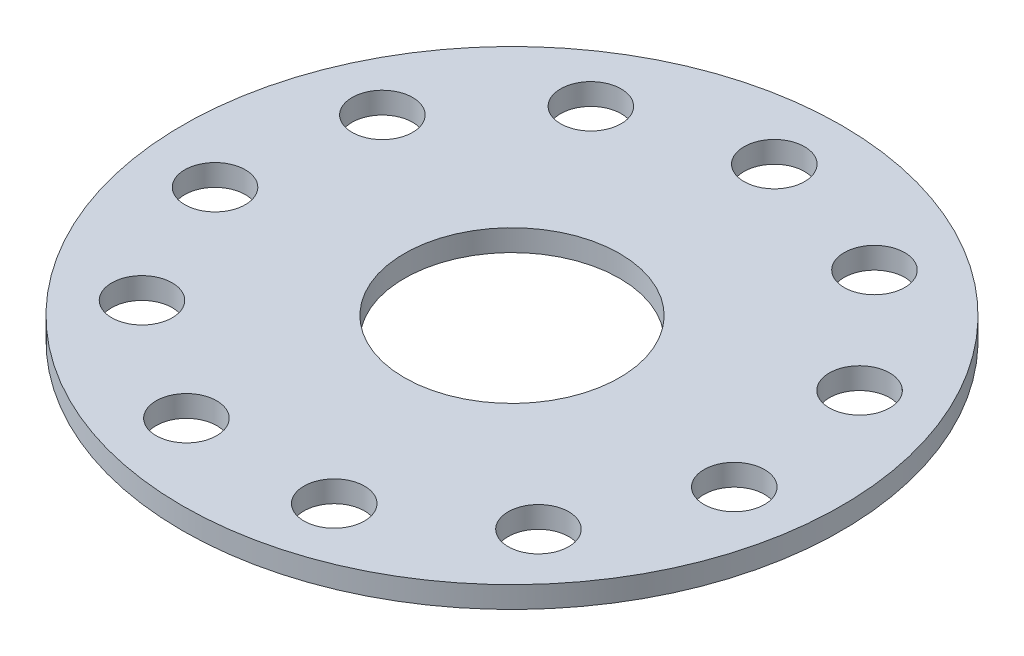
ISO-10303-21;
HEADER;
FILE_DESCRIPTION(('STEP AP214'),'2;1');
FILE_NAME('part.step','',(''),(''),'','','');
FILE_SCHEMA(('AUTOMOTIVE_DESIGN { 1 0 10303 214 1 1 1 1 }'));
ENDSEC;
DATA;
#1=APPLICATION_CONTEXT('core data for automotive mechanical design processes');
#2=APPLICATION_PROTOCOL_DEFINITION('international standard','automotive_design',2000,#1);
#3=PRODUCT_CONTEXT('',#1,'mechanical');
#4=PRODUCT('Part','Part','',(#3));
#5=PRODUCT_RELATED_PRODUCT_CATEGORY('part','',(#4));
#6=PRODUCT_DEFINITION_FORMATION('','',#4);
#7=PRODUCT_DEFINITION_CONTEXT('part definition',#1,'design');
#8=PRODUCT_DEFINITION('design','',#6,#7);
#9=PRODUCT_DEFINITION_SHAPE('','',#8);
#10=(LENGTH_UNIT() NAMED_UNIT(*) SI_UNIT(.MILLI.,.METRE.));
#11=(NAMED_UNIT(*) PLANE_ANGLE_UNIT() SI_UNIT($,.RADIAN.));
#12=(NAMED_UNIT(*) SI_UNIT($,.STERADIAN.) SOLID_ANGLE_UNIT());
#13=UNCERTAINTY_MEASURE_WITH_UNIT(LENGTH_MEASURE(1.E-05),#10,'distance_accuracy_value','');
#14=(GEOMETRIC_REPRESENTATION_CONTEXT(3) GLOBAL_UNCERTAINTY_ASSIGNED_CONTEXT((#13)) GLOBAL_UNIT_ASSIGNED_CONTEXT((#10,
#11,#12)) REPRESENTATION_CONTEXT('',''));
#15=CARTESIAN_POINT('',(0.,0.,0.));
#16=DIRECTION('',(0.,0.,1.));
#17=DIRECTION('',(1.,0.,0.));
#18=AXIS2_PLACEMENT_3D('',#15,#16,#17);
#19=CARTESIAN_POINT('',(0.,1.6002,0.));
#20=DIRECTION('',(0.,1.,0.));
#21=DIRECTION('',(0.,0.,1.));
#22=AXIS2_PLACEMENT_3D('',#19,#20,#21);
#23=PLANE('',#22);
#24=CARTESIAN_POINT('',(10.5424959403839,1.6002,-16.4044438902082));
#25=DIRECTION('',(0.,1.,0.));
#26=DIRECTION('',(-0.540640817455586,0.,0.841253532831189));
#27=AXIS2_PLACEMENT_3D('',#24,#25,#26);
#28=CIRCLE('',#27,2.25);
#29=CARTESIAN_POINT('',(9.32605410110887,1.6002,-14.511623441338));
#30=VERTEX_POINT('',#29);
#31=EDGE_CURVE('E63',#30,#30,#28,.T.);
#32=ORIENTED_EDGE('',*,*,#31,.F.);
#33=EDGE_LOOP('',(#32));
#34=FACE_BOUND('',#33,.T.);
#35=CARTESIAN_POINT('',(17.737823909413,1.6002,-8.100592753537));
#36=DIRECTION('',(0.,1.,0.));
#37=DIRECTION('',(-0.909631995354513,0.,0.415415013001897));
#38=AXIS2_PLACEMENT_3D('',#35,#36,#37);
#39=CIRCLE('',#38,2.25);
#40=CARTESIAN_POINT('',(15.6911519198654,1.6002,-7.16590897428273));
#41=VERTEX_POINT('',#40);
#42=EDGE_CURVE('E69',#41,#41,#39,.T.);
#43=ORIENTED_EDGE('',*,*,#42,.F.);
#44=EDGE_LOOP('',(#43));
#45=FACE_BOUND('',#44,.T.);
#46=CARTESIAN_POINT('',(19.3015181166782,1.6002,2.77513934632886));
#47=DIRECTION('',(0.,1.,0.));
#48=DIRECTION('',(-0.989821441880934,0.,-0.142314838273275));
#49=AXIS2_PLACEMENT_3D('',#46,#47,#48);
#50=CIRCLE('',#49,2.25);
#51=CARTESIAN_POINT('',(17.0744198724461,1.6002,2.45493096021399));
#52=VERTEX_POINT('',#51);
#53=EDGE_CURVE('E75',#52,#52,#50,.T.);
#54=ORIENTED_EDGE('',*,*,#53,.F.);
#55=EDGE_LOOP('',(#54));
#56=FACE_BOUND('',#55,.T.);
#57=CARTESIAN_POINT('',(14.7371166999082,1.6002,12.7697843119329));
#58=DIRECTION('',(0.,1.,0.));
#59=DIRECTION('',(-0.755749574354264,0.,-0.654860733945278));
#60=AXIS2_PLACEMENT_3D('',#57,#58,#59);
#61=CIRCLE('',#60,2.25);
#62=CARTESIAN_POINT('',(13.0366801576111,1.6002,11.2963476605561));
#63=VERTEX_POINT('',#62);
#64=EDGE_CURVE('E81',#63,#63,#61,.T.);
#65=ORIENTED_EDGE('',*,*,#64,.F.);
#66=EDGE_LOOP('',(#65));
#67=FACE_BOUND('',#66,.T.);
#68=CARTESIAN_POINT('',(5.49378485840803,1.6002,18.7101129854827));
#69=DIRECTION('',(0.,1.,0.));
#70=DIRECTION('',(-0.281732556841437,0.,-0.959492973614495));
#71=AXIS2_PLACEMENT_3D('',#68,#69,#70);
#72=CIRCLE('',#71,2.25);
#73=CARTESIAN_POINT('',(4.85988660551479,1.6002,16.55125379485));
#74=VERTEX_POINT('',#73);
#75=EDGE_CURVE('E87',#74,#74,#72,.T.);
#76=ORIENTED_EDGE('',*,*,#75,.F.);
#77=EDGE_LOOP('',(#76));
#78=FACE_BOUND('',#77,.T.);
#79=CARTESIAN_POINT('',(-5.49378485840776,1.6002,18.7101129854827));
#80=DIRECTION('',(0.,1.,0.));
#81=DIRECTION('',(0.281732556841423,0.,-0.959492973614499));
#82=AXIS2_PLACEMENT_3D('',#79,#80,#81);
#83=CIRCLE('',#82,2.25);
#84=CARTESIAN_POINT('',(-4.85988660551455,1.6002,16.5512537948501));
#85=VERTEX_POINT('',#84);
#86=EDGE_CURVE('E93',#85,#85,#83,.T.);
#87=ORIENTED_EDGE('',*,*,#86,.F.);
#88=EDGE_LOOP('',(#87));
#89=FACE_BOUND('',#88,.T.);
#90=CARTESIAN_POINT('',(-14.737116699908,1.6002,12.7697843119331));
#91=DIRECTION('',(0.,1.,0.));
#92=DIRECTION('',(0.755749574354255,0.,-0.654860733945289));
#93=AXIS2_PLACEMENT_3D('',#90,#91,#92);
#94=CIRCLE('',#93,2.25);
#95=CARTESIAN_POINT('',(-13.0366801576109,1.6002,11.2963476605562));
#96=VERTEX_POINT('',#95);
#97=EDGE_CURVE('E99',#96,#96,#94,.T.);
#98=ORIENTED_EDGE('',*,*,#97,.F.);
#99=EDGE_LOOP('',(#98));
#100=FACE_BOUND('',#99,.T.);
#101=CARTESIAN_POINT('',(-19.3015181166782,1.6002,2.77513934632913));
#102=DIRECTION('',(0.,1.,0.));
#103=DIRECTION('',(0.989821441880932,0.,-0.142314838273289));
#104=AXIS2_PLACEMENT_3D('',#101,#102,#103);
#105=CIRCLE('',#104,2.25);
#106=CARTESIAN_POINT('',(-17.0744198724461,1.6002,2.45493096021423));
#107=VERTEX_POINT('',#106);
#108=EDGE_CURVE('E105',#107,#107,#105,.T.);
#109=ORIENTED_EDGE('',*,*,#108,.F.);
#110=EDGE_LOOP('',(#109));
#111=FACE_BOUND('',#110,.T.);
#112=CARTESIAN_POINT('',(-17.7378239094131,1.6002,-8.10059275353674));
#113=DIRECTION('',(0.,1.,0.));
#114=DIRECTION('',(0.909631995354519,0.,0.415415013001884));
#115=AXIS2_PLACEMENT_3D('',#112,#113,#114);
#116=CIRCLE('',#115,2.25);
#117=CARTESIAN_POINT('',(-15.6911519198655,1.6002,-7.1659089742825));
#118=VERTEX_POINT('',#117);
#119=EDGE_CURVE('E111',#118,#118,#116,.T.);
#120=ORIENTED_EDGE('',*,*,#119,.F.);
#121=EDGE_LOOP('',(#120));
#122=FACE_BOUND('',#121,.T.);
#123=CARTESIAN_POINT('',(-10.5424959403842,1.6002,-16.404443890208));
#124=DIRECTION('',(0.,1.,0.));
#125=DIRECTION('',(0.540640817455599,0.,0.841253532831181));
#126=AXIS2_PLACEMENT_3D('',#123,#124,#125);
#127=CIRCLE('',#126,2.25);
#128=CARTESIAN_POINT('',(-9.32605410110908,1.6002,-14.5116234413379));
#129=VERTEX_POINT('',#128);
#130=EDGE_CURVE('E57',#129,#129,#127,.T.);
#131=ORIENTED_EDGE('',*,*,#130,.F.);
#132=EDGE_LOOP('',(#131));
#133=FACE_BOUND('',#132,.T.);
#134=CARTESIAN_POINT('',(0.,1.6002,-19.5));
#135=DIRECTION('',(0.,1.,0.));
#136=DIRECTION('',(0.,0.,1.));
#137=AXIS2_PLACEMENT_3D('',#134,#135,#136);
#138=CIRCLE('',#137,2.25);
#139=CARTESIAN_POINT('',(0.,1.6002,-17.25));
#140=VERTEX_POINT('',#139);
#141=EDGE_CURVE('E51',#140,#140,#138,.T.);
#142=ORIENTED_EDGE('',*,*,#141,.F.);
#143=EDGE_LOOP('',(#142));
#144=FACE_BOUND('',#143,.T.);
#145=CARTESIAN_POINT('',(0.,1.6002,0.));
#146=DIRECTION('',(0.,1.,0.));
#147=DIRECTION('',(0.,0.,1.));
#148=AXIS2_PLACEMENT_3D('',#145,#146,#147);
#149=CIRCLE('',#148,24.5);
#150=CARTESIAN_POINT('',(0.,1.6002,24.5));
#151=VERTEX_POINT('',#150);
#152=EDGE_CURVE('E10',#151,#151,#149,.T.);
#153=ORIENTED_EDGE('',*,*,#152,.T.);
#154=EDGE_LOOP('',(#153));
#155=FACE_BOUND('',#154,.T.);
#156=CARTESIAN_POINT('',(0.,1.6002,0.));
#157=DIRECTION('',(0.,1.,0.));
#158=DIRECTION('',(0.,0.,1.));
#159=AXIS2_PLACEMENT_3D('',#156,#157,#158);
#160=CIRCLE('',#159,8.);
#161=CARTESIAN_POINT('',(0.,1.6002,8.));
#162=VERTEX_POINT('',#161);
#163=EDGE_CURVE('E43',#162,#162,#160,.T.);
#164=ORIENTED_EDGE('',*,*,#163,.F.);
#165=EDGE_LOOP('',(#164));
#166=FACE_BOUND('',#165,.T.);
#167=ADVANCED_FACE('F32',(#34,#45,#56,#67,#78,#89,#100,#111,#122,#133,#144,#155,#166),#23,.T.);
#168=CARTESIAN_POINT('',(0.,0.,0.));
#169=DIRECTION('',(0.,1.,0.));
#170=DIRECTION('',(0.,0.,1.));
#171=AXIS2_PLACEMENT_3D('',#168,#169,#170);
#172=PLANE('',#171);
#173=CARTESIAN_POINT('',(10.5424959403839,0.,-16.4044438902082));
#174=DIRECTION('',(0.,1.,0.));
#175=DIRECTION('',(-0.540640817455586,0.,0.841253532831189));
#176=AXIS2_PLACEMENT_3D('',#173,#174,#175);
#177=CIRCLE('',#176,2.25);
#178=CARTESIAN_POINT('',(9.32605410110887,0.,-14.511623441338));
#179=VERTEX_POINT('',#178);
#180=EDGE_CURVE('E66',#179,#179,#177,.T.);
#181=ORIENTED_EDGE('',*,*,#180,.T.);
#182=EDGE_LOOP('',(#181));
#183=FACE_BOUND('',#182,.T.);
#184=CARTESIAN_POINT('',(17.737823909413,0.,-8.100592753537));
#185=DIRECTION('',(0.,1.,0.));
#186=DIRECTION('',(-0.909631995354513,0.,0.415415013001897));
#187=AXIS2_PLACEMENT_3D('',#184,#185,#186);
#188=CIRCLE('',#187,2.25);
#189=CARTESIAN_POINT('',(15.6911519198654,0.,-7.16590897428273));
#190=VERTEX_POINT('',#189);
#191=EDGE_CURVE('E72',#190,#190,#188,.T.);
#192=ORIENTED_EDGE('',*,*,#191,.T.);
#193=EDGE_LOOP('',(#192));
#194=FACE_BOUND('',#193,.T.);
#195=CARTESIAN_POINT('',(19.3015181166782,0.,2.77513934632886));
#196=DIRECTION('',(0.,1.,0.));
#197=DIRECTION('',(-0.989821441880934,0.,-0.142314838273275));
#198=AXIS2_PLACEMENT_3D('',#195,#196,#197);
#199=CIRCLE('',#198,2.25);
#200=CARTESIAN_POINT('',(17.0744198724461,0.,2.45493096021399));
#201=VERTEX_POINT('',#200);
#202=EDGE_CURVE('E78',#201,#201,#199,.T.);
#203=ORIENTED_EDGE('',*,*,#202,.T.);
#204=EDGE_LOOP('',(#203));
#205=FACE_BOUND('',#204,.T.);
#206=CARTESIAN_POINT('',(14.7371166999082,0.,12.7697843119329));
#207=DIRECTION('',(0.,1.,0.));
#208=DIRECTION('',(-0.755749574354264,0.,-0.654860733945278));
#209=AXIS2_PLACEMENT_3D('',#206,#207,#208);
#210=CIRCLE('',#209,2.25);
#211=CARTESIAN_POINT('',(13.0366801576111,0.,11.2963476605561));
#212=VERTEX_POINT('',#211);
#213=EDGE_CURVE('E84',#212,#212,#210,.T.);
#214=ORIENTED_EDGE('',*,*,#213,.T.);
#215=EDGE_LOOP('',(#214));
#216=FACE_BOUND('',#215,.T.);
#217=CARTESIAN_POINT('',(5.49378485840803,0.,18.7101129854827));
#218=DIRECTION('',(0.,1.,0.));
#219=DIRECTION('',(-0.281732556841437,0.,-0.959492973614495));
#220=AXIS2_PLACEMENT_3D('',#217,#218,#219);
#221=CIRCLE('',#220,2.25);
#222=CARTESIAN_POINT('',(4.85988660551479,0.,16.55125379485));
#223=VERTEX_POINT('',#222);
#224=EDGE_CURVE('E90',#223,#223,#221,.T.);
#225=ORIENTED_EDGE('',*,*,#224,.T.);
#226=EDGE_LOOP('',(#225));
#227=FACE_BOUND('',#226,.T.);
#228=CARTESIAN_POINT('',(-5.49378485840776,0.,18.7101129854827));
#229=DIRECTION('',(0.,1.,0.));
#230=DIRECTION('',(0.281732556841423,0.,-0.959492973614499));
#231=AXIS2_PLACEMENT_3D('',#228,#229,#230);
#232=CIRCLE('',#231,2.25);
#233=CARTESIAN_POINT('',(-4.85988660551455,0.,16.5512537948501));
#234=VERTEX_POINT('',#233);
#235=EDGE_CURVE('E96',#234,#234,#232,.T.);
#236=ORIENTED_EDGE('',*,*,#235,.T.);
#237=EDGE_LOOP('',(#236));
#238=FACE_BOUND('',#237,.T.);
#239=CARTESIAN_POINT('',(-14.737116699908,0.,12.7697843119331));
#240=DIRECTION('',(0.,1.,0.));
#241=DIRECTION('',(0.755749574354255,0.,-0.654860733945289));
#242=AXIS2_PLACEMENT_3D('',#239,#240,#241);
#243=CIRCLE('',#242,2.25);
#244=CARTESIAN_POINT('',(-13.0366801576109,0.,11.2963476605562));
#245=VERTEX_POINT('',#244);
#246=EDGE_CURVE('E102',#245,#245,#243,.T.);
#247=ORIENTED_EDGE('',*,*,#246,.T.);
#248=EDGE_LOOP('',(#247));
#249=FACE_BOUND('',#248,.T.);
#250=CARTESIAN_POINT('',(-19.3015181166782,0.,2.77513934632913));
#251=DIRECTION('',(0.,1.,0.));
#252=DIRECTION('',(0.989821441880932,0.,-0.142314838273289));
#253=AXIS2_PLACEMENT_3D('',#250,#251,#252);
#254=CIRCLE('',#253,2.25);
#255=CARTESIAN_POINT('',(-17.0744198724461,0.,2.45493096021423));
#256=VERTEX_POINT('',#255);
#257=EDGE_CURVE('E108',#256,#256,#254,.T.);
#258=ORIENTED_EDGE('',*,*,#257,.T.);
#259=EDGE_LOOP('',(#258));
#260=FACE_BOUND('',#259,.T.);
#261=CARTESIAN_POINT('',(-17.7378239094131,0.,-8.10059275353674));
#262=DIRECTION('',(0.,1.,0.));
#263=DIRECTION('',(0.909631995354519,0.,0.415415013001884));
#264=AXIS2_PLACEMENT_3D('',#261,#262,#263);
#265=CIRCLE('',#264,2.25);
#266=CARTESIAN_POINT('',(-15.6911519198655,0.,-7.1659089742825));
#267=VERTEX_POINT('',#266);
#268=EDGE_CURVE('E60',#267,#267,#265,.T.);
#269=ORIENTED_EDGE('',*,*,#268,.T.);
#270=EDGE_LOOP('',(#269));
#271=FACE_BOUND('',#270,.T.);
#272=CARTESIAN_POINT('',(-10.5424959403842,0.,-16.404443890208));
#273=DIRECTION('',(0.,1.,0.));
#274=DIRECTION('',(0.540640817455599,0.,0.841253532831181));
#275=AXIS2_PLACEMENT_3D('',#272,#273,#274);
#276=CIRCLE('',#275,2.25);
#277=CARTESIAN_POINT('',(-9.32605410110908,0.,-14.5116234413379));
#278=VERTEX_POINT('',#277);
#279=EDGE_CURVE('E54',#278,#278,#276,.T.);
#280=ORIENTED_EDGE('',*,*,#279,.T.);
#281=EDGE_LOOP('',(#280));
#282=FACE_BOUND('',#281,.T.);
#283=CARTESIAN_POINT('',(0.,0.,-19.5));
#284=DIRECTION('',(0.,1.,0.));
#285=DIRECTION('',(0.,0.,1.));
#286=AXIS2_PLACEMENT_3D('',#283,#284,#285);
#287=CIRCLE('',#286,2.25);
#288=CARTESIAN_POINT('',(0.,0.,-17.25));
#289=VERTEX_POINT('',#288);
#290=EDGE_CURVE('E48',#289,#289,#287,.T.);
#291=ORIENTED_EDGE('',*,*,#290,.T.);
#292=EDGE_LOOP('',(#291));
#293=FACE_BOUND('',#292,.T.);
#294=CARTESIAN_POINT('',(0.,0.,0.));
#295=DIRECTION('',(0.,1.,0.));
#296=DIRECTION('',(0.,0.,1.));
#297=AXIS2_PLACEMENT_3D('',#294,#295,#296);
#298=CIRCLE('',#297,24.5);
#299=CARTESIAN_POINT('',(0.,0.,24.5));
#300=VERTEX_POINT('',#299);
#301=EDGE_CURVE('E36',#300,#300,#298,.T.);
#302=ORIENTED_EDGE('',*,*,#301,.F.);
#303=EDGE_LOOP('',(#302));
#304=FACE_BOUND('',#303,.T.);
#305=CARTESIAN_POINT('',(0.,0.,0.));
#306=DIRECTION('',(0.,1.,0.));
#307=DIRECTION('',(0.,0.,1.));
#308=AXIS2_PLACEMENT_3D('',#305,#306,#307);
#309=CIRCLE('',#308,8.);
#310=CARTESIAN_POINT('',(0.,0.,8.));
#311=VERTEX_POINT('',#310);
#312=EDGE_CURVE('E45',#311,#311,#309,.T.);
#313=ORIENTED_EDGE('',*,*,#312,.T.);
#314=EDGE_LOOP('',(#313));
#315=FACE_BOUND('',#314,.T.);
#316=ADVANCED_FACE('F117',(#183,#194,#205,#216,#227,#238,#249,#260,#271,#282,#293,#304,#315),
#172,.F.);
#317=CARTESIAN_POINT('',(0.,1.6002,0.));
#318=DIRECTION('',(0.,-1.,0.));
#319=DIRECTION('',(0.,0.,-1.));
#320=AXIS2_PLACEMENT_3D('',#317,#318,#319);
#321=CYLINDRICAL_SURFACE('',#320,24.5);
#322=ORIENTED_EDGE('',*,*,#152,.F.);
#323=EDGE_LOOP('',(#322));
#324=FACE_BOUND('',#323,.T.);
#325=ORIENTED_EDGE('',*,*,#301,.T.);
#326=EDGE_LOOP('',(#325));
#327=FACE_BOUND('',#326,.T.);
#328=ADVANCED_FACE('F34',(#324,#327),#321,.T.);
#329=CARTESIAN_POINT('',(0.,1.6002,0.));
#330=DIRECTION('',(0.,-1.,0.));
#331=DIRECTION('',(0.,0.,-1.));
#332=AXIS2_PLACEMENT_3D('',#329,#330,#331);
#333=CYLINDRICAL_SURFACE('',#332,8.);
#334=ORIENTED_EDGE('',*,*,#163,.T.);
#335=EDGE_LOOP('',(#334));
#336=FACE_BOUND('',#335,.T.);
#337=ORIENTED_EDGE('',*,*,#312,.F.);
#338=EDGE_LOOP('',(#337));
#339=FACE_BOUND('',#338,.T.);
#340=ADVANCED_FACE('F138',(#336,#339),#333,.F.);
#341=CARTESIAN_POINT('',(0.,0.,-19.5));
#342=DIRECTION('',(0.,1.,0.));
#343=DIRECTION('',(0.,0.,1.));
#344=AXIS2_PLACEMENT_3D('',#341,#342,#343);
#345=CYLINDRICAL_SURFACE('',#344,2.25);
#346=ORIENTED_EDGE('',*,*,#290,.F.);
#347=EDGE_LOOP('',(#346));
#348=FACE_BOUND('',#347,.T.);
#349=ORIENTED_EDGE('',*,*,#141,.T.);
#350=EDGE_LOOP('',(#349));
#351=FACE_BOUND('',#350,.T.);
#352=ADVANCED_FACE('F141',(#348,#351),#345,.F.);
#353=CARTESIAN_POINT('',(-10.5424959403842,0.,-16.404443890208));
#354=DIRECTION('',(0.,1.,0.));
#355=DIRECTION('',(0.,0.,1.));
#356=AXIS2_PLACEMENT_3D('',#353,#354,#355);
#357=CYLINDRICAL_SURFACE('',#356,2.25);
#358=ORIENTED_EDGE('',*,*,#279,.F.);
#359=EDGE_LOOP('',(#358));
#360=FACE_BOUND('',#359,.T.);
#361=ORIENTED_EDGE('',*,*,#130,.T.);
#362=EDGE_LOOP('',(#361));
#363=FACE_BOUND('',#362,.T.);
#364=ADVANCED_FACE('F124',(#360,#363),#357,.F.);
#365=CARTESIAN_POINT('',(-17.7378239094131,0.,-8.10059275353674));
#366=DIRECTION('',(0.,1.,0.));
#367=DIRECTION('',(0.,0.,1.));
#368=AXIS2_PLACEMENT_3D('',#365,#366,#367);
#369=CYLINDRICAL_SURFACE('',#368,2.25);
#370=ORIENTED_EDGE('',*,*,#268,.F.);
#371=EDGE_LOOP('',(#370));
#372=FACE_BOUND('',#371,.T.);
#373=ORIENTED_EDGE('',*,*,#119,.T.);
#374=EDGE_LOOP('',(#373));
#375=FACE_BOUND('',#374,.T.);
#376=ADVANCED_FACE('F120',(#372,#375),#369,.F.);
#377=CARTESIAN_POINT('',(-19.3015181166782,0.,2.77513934632913));
#378=DIRECTION('',(0.,1.,0.));
#379=DIRECTION('',(0.,0.,1.));
#380=AXIS2_PLACEMENT_3D('',#377,#378,#379);
#381=CYLINDRICAL_SURFACE('',#380,2.25);
#382=ORIENTED_EDGE('',*,*,#257,.F.);
#383=EDGE_LOOP('',(#382));
#384=FACE_BOUND('',#383,.T.);
#385=ORIENTED_EDGE('',*,*,#108,.T.);
#386=EDGE_LOOP('',(#385));
#387=FACE_BOUND('',#386,.T.);
#388=ADVANCED_FACE('F123',(#384,#387),#381,.F.);
#389=CARTESIAN_POINT('',(-14.737116699908,0.,12.7697843119331));
#390=DIRECTION('',(0.,1.,0.));
#391=DIRECTION('',(0.,0.,1.));
#392=AXIS2_PLACEMENT_3D('',#389,#390,#391);
#393=CYLINDRICAL_SURFACE('',#392,2.25);
#394=ORIENTED_EDGE('',*,*,#246,.F.);
#395=EDGE_LOOP('',(#394));
#396=FACE_BOUND('',#395,.T.);
#397=ORIENTED_EDGE('',*,*,#97,.T.);
#398=EDGE_LOOP('',(#397));
#399=FACE_BOUND('',#398,.T.);
#400=ADVANCED_FACE('F182',(#396,#399),#393,.F.);
#401=CARTESIAN_POINT('',(-5.49378485840776,0.,18.7101129854827));
#402=DIRECTION('',(0.,1.,0.));
#403=DIRECTION('',(0.,0.,1.));
#404=AXIS2_PLACEMENT_3D('',#401,#402,#403);
#405=CYLINDRICAL_SURFACE('',#404,2.25);
#406=ORIENTED_EDGE('',*,*,#235,.F.);
#407=EDGE_LOOP('',(#406));
#408=FACE_BOUND('',#407,.T.);
#409=ORIENTED_EDGE('',*,*,#86,.T.);
#410=EDGE_LOOP('',(#409));
#411=FACE_BOUND('',#410,.T.);
#412=ADVANCED_FACE('F178',(#408,#411),#405,.F.);
#413=CARTESIAN_POINT('',(5.49378485840803,0.,18.7101129854827));
#414=DIRECTION('',(0.,1.,0.));
#415=DIRECTION('',(0.,0.,1.));
#416=AXIS2_PLACEMENT_3D('',#413,#414,#415);
#417=CYLINDRICAL_SURFACE('',#416,2.25);
#418=ORIENTED_EDGE('',*,*,#224,.F.);
#419=EDGE_LOOP('',(#418));
#420=FACE_BOUND('',#419,.T.);
#421=ORIENTED_EDGE('',*,*,#75,.T.);
#422=EDGE_LOOP('',(#421));
#423=FACE_BOUND('',#422,.T.);
#424=ADVANCED_FACE('F174',(#420,#423),#417,.F.);
#425=CARTESIAN_POINT('',(14.7371166999082,0.,12.7697843119329));
#426=DIRECTION('',(0.,1.,0.));
#427=DIRECTION('',(0.,0.,1.));
#428=AXIS2_PLACEMENT_3D('',#425,#426,#427);
#429=CYLINDRICAL_SURFACE('',#428,2.25);
#430=ORIENTED_EDGE('',*,*,#213,.F.);
#431=EDGE_LOOP('',(#430));
#432=FACE_BOUND('',#431,.T.);
#433=ORIENTED_EDGE('',*,*,#64,.T.);
#434=EDGE_LOOP('',(#433));
#435=FACE_BOUND('',#434,.T.);
#436=ADVANCED_FACE('F170',(#432,#435),#429,.F.);
#437=CARTESIAN_POINT('',(19.3015181166782,0.,2.77513934632886));
#438=DIRECTION('',(0.,1.,0.));
#439=DIRECTION('',(0.,0.,1.));
#440=AXIS2_PLACEMENT_3D('',#437,#438,#439);
#441=CYLINDRICAL_SURFACE('',#440,2.25);
#442=ORIENTED_EDGE('',*,*,#202,.F.);
#443=EDGE_LOOP('',(#442));
#444=FACE_BOUND('',#443,.T.);
#445=ORIENTED_EDGE('',*,*,#53,.T.);
#446=EDGE_LOOP('',(#445));
#447=FACE_BOUND('',#446,.T.);
#448=ADVANCED_FACE('F166',(#444,#447),#441,.F.);
#449=CARTESIAN_POINT('',(17.737823909413,0.,-8.100592753537));
#450=DIRECTION('',(0.,1.,0.));
#451=DIRECTION('',(0.,0.,1.));
#452=AXIS2_PLACEMENT_3D('',#449,#450,#451);
#453=CYLINDRICAL_SURFACE('',#452,2.25);
#454=ORIENTED_EDGE('',*,*,#191,.F.);
#455=EDGE_LOOP('',(#454));
#456=FACE_BOUND('',#455,.T.);
#457=ORIENTED_EDGE('',*,*,#42,.T.);
#458=EDGE_LOOP('',(#457));
#459=FACE_BOUND('',#458,.T.);
#460=ADVANCED_FACE('F162',(#456,#459),#453,.F.);
#461=CARTESIAN_POINT('',(10.5424959403839,0.,-16.4044438902082));
#462=DIRECTION('',(0.,1.,0.));
#463=DIRECTION('',(0.,0.,1.));
#464=AXIS2_PLACEMENT_3D('',#461,#462,#463);
#465=CYLINDRICAL_SURFACE('',#464,2.25);
#466=ORIENTED_EDGE('',*,*,#180,.F.);
#467=EDGE_LOOP('',(#466));
#468=FACE_BOUND('',#467,.T.);
#469=ORIENTED_EDGE('',*,*,#31,.T.);
#470=EDGE_LOOP('',(#469));
#471=FACE_BOUND('',#470,.T.);
#472=ADVANCED_FACE('F159',(#468,#471),#465,.F.);
#473=CLOSED_SHELL('',(#167,#316,#328,#340,#352,#364,#376,#388,#400,#412,#424,#436,#448,#460,#472));
#474=MANIFOLD_SOLID_BREP('B2',#473);
#475=ADVANCED_BREP_SHAPE_REPRESENTATION('',(#18,#474),#14);
#476=SHAPE_DEFINITION_REPRESENTATION(#9,#475);
ENDSEC;
END-ISO-10303-21;
